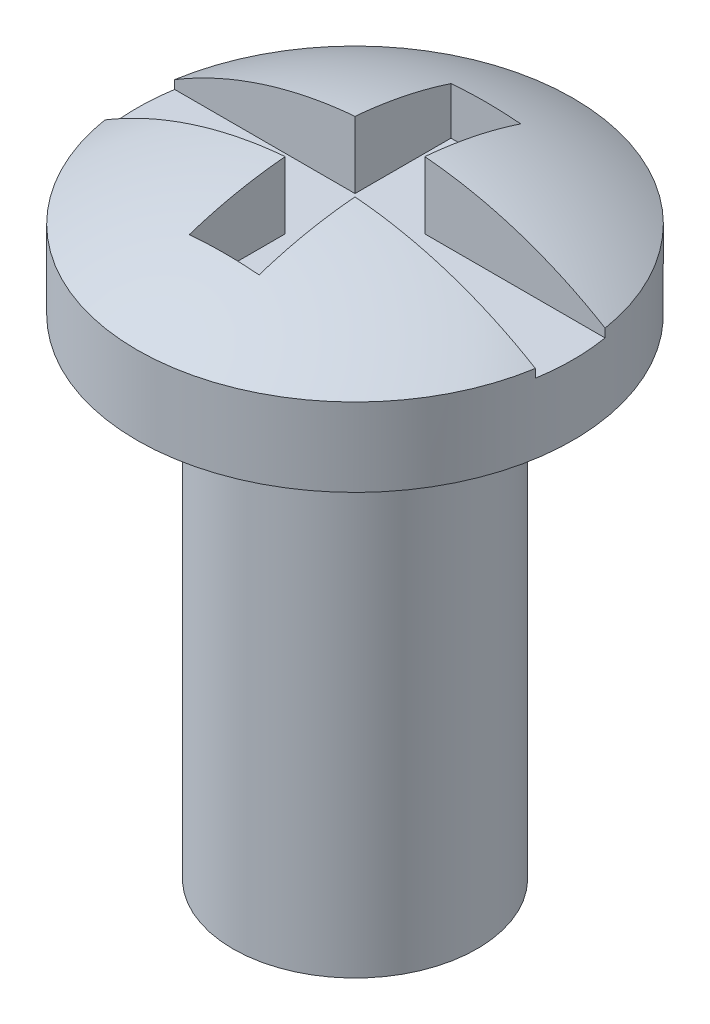
ISO-10303-21;
HEADER;
FILE_DESCRIPTION(('STEP AP214'),'2;1');
FILE_NAME('part.step','',(''),(''),'','','');
FILE_SCHEMA(('AUTOMOTIVE_DESIGN { 1 0 10303 214 1 1 1 1 }'));
ENDSEC;
DATA;
#1=APPLICATION_CONTEXT('core data for automotive mechanical design processes');
#2=APPLICATION_PROTOCOL_DEFINITION('international standard','automotive_design',2000,#1);
#3=PRODUCT_CONTEXT('',#1,'mechanical');
#4=PRODUCT('Part','Part','',(#3));
#5=PRODUCT_RELATED_PRODUCT_CATEGORY('part','',(#4));
#6=PRODUCT_DEFINITION_FORMATION('','',#4);
#7=PRODUCT_DEFINITION_CONTEXT('part definition',#1,'design');
#8=PRODUCT_DEFINITION('design','',#6,#7);
#9=PRODUCT_DEFINITION_SHAPE('','',#8);
#10=(LENGTH_UNIT() NAMED_UNIT(*) SI_UNIT(.MILLI.,.METRE.));
#11=(NAMED_UNIT(*) PLANE_ANGLE_UNIT() SI_UNIT($,.RADIAN.));
#12=(NAMED_UNIT(*) SI_UNIT($,.STERADIAN.) SOLID_ANGLE_UNIT());
#13=UNCERTAINTY_MEASURE_WITH_UNIT(LENGTH_MEASURE(1.E-05),#10,'distance_accuracy_value','');
#14=(GEOMETRIC_REPRESENTATION_CONTEXT(3) GLOBAL_UNCERTAINTY_ASSIGNED_CONTEXT((#13)) GLOBAL_UNIT_ASSIGNED_CONTEXT((#10,
#11,#12)) REPRESENTATION_CONTEXT('',''));
#15=CARTESIAN_POINT('',(0.,0.,0.));
#16=DIRECTION('',(0.,0.,1.));
#17=DIRECTION('',(1.,0.,0.));
#18=AXIS2_PLACEMENT_3D('',#15,#16,#17);
#19=CARTESIAN_POINT('',(-3.50234861591695,8.,-0.5));
#20=DIRECTION('',(0.,0.,-1.));
#21=DIRECTION('',(-1.,0.,0.));
#22=AXIS2_PLACEMENT_3D('',#19,#20,#21);
#23=PLANE('',#22);
#24=CARTESIAN_POINT('',(0.,3.,-0.5));
#25=DIRECTION('',(0.,0.,-1.));
#26=DIRECTION('',(-1.,0.,0.));
#27=AXIS2_PLACEMENT_3D('',#24,#25,#26);
#28=CIRCLE('',#27,5.9791303715507);
#29=CARTESIAN_POINT('',(-3.08474066981327,8.12195031213697,-0.5));
#30=VERTEX_POINT('',#29);
#31=CARTESIAN_POINT('',(-0.5,8.95818764390649,-0.5));
#32=VERTEX_POINT('',#31);
#33=EDGE_CURVE('E221',#30,#32,#28,.T.);
#34=ORIENTED_EDGE('',*,*,#33,.F.);
#35=DIRECTION('',(0.,-1.,0.));
#36=VECTOR('',#35,1.);
#37=CARTESIAN_POINT('',(-3.08474066981327,9.,-0.5));
#38=LINE('',#37,#36);
#39=CARTESIAN_POINT('',(-3.08474066981327,8.,-0.5));
#40=VERTEX_POINT('',#39);
#41=EDGE_CURVE('E164',#40,#30,#38,.F.);
#42=ORIENTED_EDGE('',*,*,#41,.F.);
#43=DIRECTION('',(-1.,0.,0.));
#44=VECTOR('',#43,1.);
#45=CARTESIAN_POINT('',(-3.50234861591695,8.,-0.5));
#46=LINE('',#45,#44);
#47=CARTESIAN_POINT('',(-0.5,8.,-0.5));
#48=VERTEX_POINT('',#47);
#49=EDGE_CURVE('E155',#48,#40,#46,.T.);
#50=ORIENTED_EDGE('',*,*,#49,.F.);
#51=DIRECTION('',(0.,1.,0.));
#52=VECTOR('',#51,1.);
#53=CARTESIAN_POINT('',(-0.5,8.,-0.5));
#54=LINE('',#53,#52);
#55=EDGE_CURVE('E148',#48,#32,#54,.T.);
#56=ORIENTED_EDGE('',*,*,#55,.T.);
#57=EDGE_LOOP('',(#34,#42,#50,#56));
#58=FACE_BOUND('',#57,.T.);
#59=ADVANCED_FACE('F32',(#58),#23,.F.);
#60=CARTESIAN_POINT('',(-3.50234861591695,8.,0.5));
#61=DIRECTION('',(0.,0.,1.));
#62=DIRECTION('',(1.,0.,0.));
#63=AXIS2_PLACEMENT_3D('',#60,#61,#62);
#64=PLANE('',#63);
#65=CARTESIAN_POINT('',(0.,3.,0.5));
#66=DIRECTION('',(0.,0.,1.));
#67=DIRECTION('',(1.,0.,0.));
#68=AXIS2_PLACEMENT_3D('',#65,#66,#67);
#69=CIRCLE('',#68,5.9791303715507);
#70=CARTESIAN_POINT('',(-0.499999999999999,8.95818764390649,0.5));
#71=VERTEX_POINT('',#70);
#72=CARTESIAN_POINT('',(-3.08474066981327,8.12195031213697,0.5));
#73=VERTEX_POINT('',#72);
#74=EDGE_CURVE('E191',#71,#73,#69,.T.);
#75=ORIENTED_EDGE('',*,*,#74,.F.);
#76=DIRECTION('',(0.,-1.,0.));
#77=VECTOR('',#76,1.);
#78=CARTESIAN_POINT('',(-0.5,8.,0.5));
#79=LINE('',#78,#77);
#80=CARTESIAN_POINT('',(-0.499999999999999,8.,0.5));
#81=VERTEX_POINT('',#80);
#82=EDGE_CURVE('E40',#71,#81,#79,.T.);
#83=ORIENTED_EDGE('',*,*,#82,.T.);
#84=DIRECTION('',(1.,0.,0.));
#85=VECTOR('',#84,1.);
#86=CARTESIAN_POINT('',(-3.50234861591695,8.,0.5));
#87=LINE('',#86,#85);
#88=CARTESIAN_POINT('',(-3.08474066981327,8.,0.5));
#89=VERTEX_POINT('',#88);
#90=EDGE_CURVE('E152',#89,#81,#87,.T.);
#91=ORIENTED_EDGE('',*,*,#90,.F.);
#92=DIRECTION('',(0.,-1.,0.));
#93=VECTOR('',#92,1.);
#94=CARTESIAN_POINT('',(-3.08474066981327,9.,0.5));
#95=LINE('',#94,#93);
#96=EDGE_CURVE('E162',#73,#89,#95,.T.);
#97=ORIENTED_EDGE('',*,*,#96,.F.);
#98=EDGE_LOOP('',(#75,#83,#91,#97));
#99=FACE_BOUND('',#98,.T.);
#100=ADVANCED_FACE('F189',(#99),#64,.F.);
#101=CARTESIAN_POINT('',(0.,9.,0.));
#102=DIRECTION('',(0.,-1.,0.));
#103=DIRECTION('',(0.,0.,-1.));
#104=AXIS2_PLACEMENT_3D('',#101,#102,#103);
#105=CYLINDRICAL_SURFACE('',#104,3.125);
#106=CARTESIAN_POINT('',(0.,7.,0.));
#107=DIRECTION('',(0.,1.,0.));
#108=DIRECTION('',(0.,0.,1.));
#109=AXIS2_PLACEMENT_3D('',#106,#107,#108);
#110=CIRCLE('',#109,3.125);
#111=CARTESIAN_POINT('',(0.,7.,3.125));
#112=VERTEX_POINT('',#111);
#113=EDGE_CURVE('E169',#112,#112,#110,.T.);
#114=ORIENTED_EDGE('',*,*,#113,.T.);
#115=EDGE_LOOP('',(#114));
#116=FACE_BOUND('',#115,.T.);
#117=CARTESIAN_POINT('',(0.,8.12195031213697,0.));
#118=DIRECTION('',(0.,-1.,0.));
#119=DIRECTION('',(0.,0.,-1.));
#120=AXIS2_PLACEMENT_3D('',#117,#118,#119);
#121=CIRCLE('',#120,3.125);
#122=CARTESIAN_POINT('',(3.08474066981327,8.12195031213697,0.5));
#123=VERTEX_POINT('',#122);
#124=EDGE_CURVE('E210',#73,#123,#121,.F.);
#125=ORIENTED_EDGE('',*,*,#124,.F.);
#126=ORIENTED_EDGE('',*,*,#96,.T.);
#127=CARTESIAN_POINT('',(0.,8.,0.));
#128=DIRECTION('',(0.,1.,0.));
#129=DIRECTION('',(0.,0.,1.));
#130=AXIS2_PLACEMENT_3D('',#127,#128,#129);
#131=CIRCLE('',#130,3.125);
#132=EDGE_CURVE('E176',#40,#89,#131,.T.);
#133=ORIENTED_EDGE('',*,*,#132,.F.);
#134=ORIENTED_EDGE('',*,*,#41,.T.);
#135=CARTESIAN_POINT('',(3.08474066981327,8.12195031213697,-0.5));
#136=VERTEX_POINT('',#135);
#137=EDGE_CURVE('E216',#136,#30,#121,.F.);
#138=ORIENTED_EDGE('',*,*,#137,.F.);
#139=DIRECTION('',(0.,-1.,0.));
#140=VECTOR('',#139,1.);
#141=CARTESIAN_POINT('',(3.08474066981327,9.,-0.5));
#142=LINE('',#141,#140);
#143=CARTESIAN_POINT('',(3.08474066981327,8.,-0.5));
#144=VERTEX_POINT('',#143);
#145=EDGE_CURVE('E167',#136,#144,#142,.T.);
#146=ORIENTED_EDGE('',*,*,#145,.T.);
#147=CARTESIAN_POINT('',(3.08474066981327,8.,0.5));
#148=VERTEX_POINT('',#147);
#149=EDGE_CURVE('E181',#148,#144,#131,.T.);
#150=ORIENTED_EDGE('',*,*,#149,.F.);
#151=DIRECTION('',(0.,-1.,0.));
#152=VECTOR('',#151,1.);
#153=CARTESIAN_POINT('',(3.08474066981327,9.,0.5));
#154=LINE('',#153,#152);
#155=EDGE_CURVE('E159',#148,#123,#154,.F.);
#156=ORIENTED_EDGE('',*,*,#155,.T.);
#157=EDGE_LOOP('',(#125,#126,#133,#134,#138,#146,#150,#156));
#158=FACE_BOUND('',#157,.T.);
#159=ADVANCED_FACE('F208',(#116,#158),#105,.T.);
#160=CARTESIAN_POINT('',(0.,3.,-0.5));
#161=DIRECTION('',(0.,0.,-1.));
#162=DIRECTION('',(-1.,0.,0.));
#163=AXIS2_PLACEMENT_3D('',#160,#161,#162);
#164=CIRCLE('',#163,5.9791303715507);
#165=CARTESIAN_POINT('',(0.5,8.95818764390649,-0.5));
#166=VERTEX_POINT('',#165);
#167=EDGE_CURVE('E222',#166,#136,#164,.T.);
#168=ORIENTED_EDGE('',*,*,#167,.F.);
#169=DIRECTION('',(0.,-1.,0.));
#170=VECTOR('',#169,1.);
#171=CARTESIAN_POINT('',(0.5,8.,-0.5));
#172=LINE('',#171,#170);
#173=CARTESIAN_POINT('',(0.5,8.,-0.5));
#174=VERTEX_POINT('',#173);
#175=EDGE_CURVE('E131',#166,#174,#172,.T.);
#176=ORIENTED_EDGE('',*,*,#175,.T.);
#177=EDGE_CURVE('E156',#144,#174,#46,.T.);
#178=ORIENTED_EDGE('',*,*,#177,.F.);
#179=ORIENTED_EDGE('',*,*,#145,.F.);
#180=EDGE_LOOP('',(#168,#176,#178,#179));
#181=FACE_BOUND('',#180,.T.);
#182=ADVANCED_FACE('F230',(#181),#23,.F.);
#183=CARTESIAN_POINT('',(0.,3.,0.5));
#184=DIRECTION('',(0.,0.,1.));
#185=DIRECTION('',(1.,0.,0.));
#186=AXIS2_PLACEMENT_3D('',#183,#184,#185);
#187=CIRCLE('',#186,5.9791303715507);
#188=CARTESIAN_POINT('',(0.5,8.95818764390649,0.5));
#189=VERTEX_POINT('',#188);
#190=EDGE_CURVE('E214',#123,#189,#187,.T.);
#191=ORIENTED_EDGE('',*,*,#190,.F.);
#192=ORIENTED_EDGE('',*,*,#155,.F.);
#193=CARTESIAN_POINT('',(0.5,8.,0.5));
#194=VERTEX_POINT('',#193);
#195=EDGE_CURVE('E151',#194,#148,#87,.T.);
#196=ORIENTED_EDGE('',*,*,#195,.F.);
#197=DIRECTION('',(0.,1.,0.));
#198=VECTOR('',#197,1.);
#199=CARTESIAN_POINT('',(0.5,8.,0.5));
#200=LINE('',#199,#198);
#201=EDGE_CURVE('E182',#194,#189,#200,.T.);
#202=ORIENTED_EDGE('',*,*,#201,.T.);
#203=EDGE_LOOP('',(#191,#192,#196,#202));
#204=FACE_BOUND('',#203,.T.);
#205=ADVANCED_FACE('F237',(#204),#64,.F.);
#206=CARTESIAN_POINT('',(0.5,8.,-1.875));
#207=DIRECTION('',(1.,0.,0.));
#208=DIRECTION('',(0.,0.,-1.));
#209=AXIS2_PLACEMENT_3D('',#206,#207,#208);
#210=PLANE('',#209);
#211=CARTESIAN_POINT('',(0.5,3.,0.));
#212=DIRECTION('',(1.,0.,0.));
#213=DIRECTION('',(0.,0.,-1.));
#214=AXIS2_PLACEMENT_3D('',#211,#212,#213);
#215=CIRCLE('',#214,5.9791303715507);
#216=CARTESIAN_POINT('',(0.499999999999999,8.67753247458788,1.875));
#217=VERTEX_POINT('',#216);
#218=EDGE_CURVE('E47',#189,#217,#215,.T.);
#219=ORIENTED_EDGE('',*,*,#218,.F.);
#220=ORIENTED_EDGE('',*,*,#201,.F.);
#221=DIRECTION('',(0.,0.,-1.));
#222=VECTOR('',#221,1.);
#223=CARTESIAN_POINT('',(0.5,8.,-1.875));
#224=LINE('',#223,#222);
#225=CARTESIAN_POINT('',(0.499999999999999,8.,1.875));
#226=VERTEX_POINT('',#225);
#227=EDGE_CURVE('E234',#226,#194,#224,.T.);
#228=ORIENTED_EDGE('',*,*,#227,.F.);
#229=DIRECTION('',(0.,1.,0.));
#230=VECTOR('',#229,1.);
#231=CARTESIAN_POINT('',(0.499999999999999,8.,1.875));
#232=LINE('',#231,#230);
#233=EDGE_CURVE('E137',#226,#217,#232,.T.);
#234=ORIENTED_EDGE('',*,*,#233,.T.);
#235=EDGE_LOOP('',(#219,#220,#228,#234));
#236=FACE_BOUND('',#235,.T.);
#237=ADVANCED_FACE('F240',(#236),#210,.F.);
#238=CARTESIAN_POINT('',(-0.5,8.,-1.875));
#239=DIRECTION('',(-1.,0.,0.));
#240=DIRECTION('',(0.,0.,1.));
#241=AXIS2_PLACEMENT_3D('',#238,#239,#240);
#242=PLANE('',#241);
#243=CARTESIAN_POINT('',(-0.5,3.,0.));
#244=DIRECTION('',(-1.,0.,0.));
#245=DIRECTION('',(0.,0.,1.));
#246=AXIS2_PLACEMENT_3D('',#243,#244,#245);
#247=CIRCLE('',#246,5.9791303715507);
#248=CARTESIAN_POINT('',(-0.499999999999999,8.67753247458788,1.875));
#249=VERTEX_POINT('',#248);
#250=EDGE_CURVE('E241',#249,#71,#247,.T.);
#251=ORIENTED_EDGE('',*,*,#250,.F.);
#252=DIRECTION('',(0.,1.,0.));
#253=VECTOR('',#252,1.);
#254=CARTESIAN_POINT('',(-0.499999999999999,8.,1.875));
#255=LINE('',#254,#253);
#256=CARTESIAN_POINT('',(-0.499999999999999,8.,1.875));
#257=VERTEX_POINT('',#256);
#258=EDGE_CURVE('E141',#257,#249,#255,.T.);
#259=ORIENTED_EDGE('',*,*,#258,.F.);
#260=DIRECTION('',(0.,0.,1.));
#261=VECTOR('',#260,1.);
#262=CARTESIAN_POINT('',(-0.5,8.,-1.875));
#263=LINE('',#262,#261);
#264=EDGE_CURVE('E195',#81,#257,#263,.T.);
#265=ORIENTED_EDGE('',*,*,#264,.F.);
#266=ORIENTED_EDGE('',*,*,#82,.F.);
#267=EDGE_LOOP('',(#251,#259,#265,#266));
#268=FACE_BOUND('',#267,.T.);
#269=ADVANCED_FACE('F196',(#268),#242,.F.);
#270=CARTESIAN_POINT('',(-0.499999999999999,8.,1.875));
#271=DIRECTION('',(0.,0.,1.));
#272=DIRECTION('',(1.,0.,0.));
#273=AXIS2_PLACEMENT_3D('',#270,#271,#272);
#274=PLANE('',#273);
#275=CARTESIAN_POINT('',(0.,3.,1.875));
#276=DIRECTION('',(0.,0.,1.));
#277=DIRECTION('',(1.,0.,0.));
#278=AXIS2_PLACEMENT_3D('',#275,#276,#277);
#279=CIRCLE('',#278,5.699506557589);
#280=EDGE_CURVE('E224',#217,#249,#279,.T.);
#281=ORIENTED_EDGE('',*,*,#280,.F.);
#282=ORIENTED_EDGE('',*,*,#233,.F.);
#283=DIRECTION('',(1.,0.,0.));
#284=VECTOR('',#283,1.);
#285=CARTESIAN_POINT('',(-0.499999999999999,8.,1.875));
#286=LINE('',#285,#284);
#287=EDGE_CURVE('E246',#257,#226,#286,.T.);
#288=ORIENTED_EDGE('',*,*,#287,.F.);
#289=ORIENTED_EDGE('',*,*,#258,.T.);
#290=EDGE_LOOP('',(#281,#282,#288,#289));
#291=FACE_BOUND('',#290,.T.);
#292=ADVANCED_FACE('F295',(#291),#274,.F.);
#293=CARTESIAN_POINT('',(-0.5,3.,0.));
#294=DIRECTION('',(-1.,0.,0.));
#295=DIRECTION('',(0.,0.,1.));
#296=AXIS2_PLACEMENT_3D('',#293,#294,#295);
#297=CIRCLE('',#296,5.9791303715507);
#298=CARTESIAN_POINT('',(-0.5,8.67753247458788,-1.875));
#299=VERTEX_POINT('',#298);
#300=EDGE_CURVE('E54',#32,#299,#297,.T.);
#301=ORIENTED_EDGE('',*,*,#300,.F.);
#302=ORIENTED_EDGE('',*,*,#55,.F.);
#303=CARTESIAN_POINT('',(-0.5,8.,-1.875));
#304=VERTEX_POINT('',#303);
#305=EDGE_CURVE('E200',#304,#48,#263,.T.);
#306=ORIENTED_EDGE('',*,*,#305,.F.);
#307=DIRECTION('',(0.,1.,0.));
#308=VECTOR('',#307,1.);
#309=CARTESIAN_POINT('',(-0.5,8.,-1.875));
#310=LINE('',#309,#308);
#311=EDGE_CURVE('E136',#304,#299,#310,.T.);
#312=ORIENTED_EDGE('',*,*,#311,.T.);
#313=EDGE_LOOP('',(#301,#302,#306,#312));
#314=FACE_BOUND('',#313,.T.);
#315=ADVANCED_FACE('F251',(#314),#242,.F.);
#316=CARTESIAN_POINT('',(0.5,3.,0.));
#317=DIRECTION('',(1.,0.,0.));
#318=DIRECTION('',(0.,0.,-1.));
#319=AXIS2_PLACEMENT_3D('',#316,#317,#318);
#320=CIRCLE('',#319,5.9791303715507);
#321=CARTESIAN_POINT('',(0.5,8.67753247458788,-1.875));
#322=VERTEX_POINT('',#321);
#323=EDGE_CURVE('E119',#322,#166,#320,.T.);
#324=ORIENTED_EDGE('',*,*,#323,.F.);
#325=DIRECTION('',(0.,1.,0.));
#326=VECTOR('',#325,1.);
#327=CARTESIAN_POINT('',(0.5,8.,-1.875));
#328=LINE('',#327,#326);
#329=CARTESIAN_POINT('',(0.5,8.,-1.875));
#330=VERTEX_POINT('',#329);
#331=EDGE_CURVE('E129',#330,#322,#328,.T.);
#332=ORIENTED_EDGE('',*,*,#331,.F.);
#333=EDGE_CURVE('E231',#174,#330,#224,.T.);
#334=ORIENTED_EDGE('',*,*,#333,.F.);
#335=ORIENTED_EDGE('',*,*,#175,.F.);
#336=EDGE_LOOP('',(#324,#332,#334,#335));
#337=FACE_BOUND('',#336,.T.);
#338=ADVANCED_FACE('F127',(#337),#210,.F.);
#339=CARTESIAN_POINT('',(-0.5,8.,-1.875));
#340=DIRECTION('',(0.,0.,-1.));
#341=DIRECTION('',(-1.,0.,0.));
#342=AXIS2_PLACEMENT_3D('',#339,#340,#341);
#343=PLANE('',#342);
#344=CARTESIAN_POINT('',(0.,3.,-1.875));
#345=DIRECTION('',(0.,0.,-1.));
#346=DIRECTION('',(-1.,0.,0.));
#347=AXIS2_PLACEMENT_3D('',#344,#345,#346);
#348=CIRCLE('',#347,5.699506557589);
#349=EDGE_CURVE('E11',#299,#322,#348,.T.);
#350=ORIENTED_EDGE('',*,*,#349,.F.);
#351=ORIENTED_EDGE('',*,*,#311,.F.);
#352=DIRECTION('',(-1.,0.,0.));
#353=VECTOR('',#352,1.);
#354=CARTESIAN_POINT('',(-0.5,8.,-1.875));
#355=LINE('',#354,#353);
#356=EDGE_CURVE('E135',#330,#304,#355,.T.);
#357=ORIENTED_EDGE('',*,*,#356,.F.);
#358=ORIENTED_EDGE('',*,*,#331,.T.);
#359=EDGE_LOOP('',(#350,#351,#357,#358));
#360=FACE_BOUND('',#359,.T.);
#361=ADVANCED_FACE('F133',(#360),#343,.F.);
#362=CARTESIAN_POINT('',(0.,7.,0.));
#363=DIRECTION('',(0.,-1.,0.));
#364=DIRECTION('',(0.,0.,-1.));
#365=AXIS2_PLACEMENT_3D('',#362,#363,#364);
#366=CYLINDRICAL_SURFACE('',#365,1.75);
#367=CARTESIAN_POINT('',(0.,7.,0.));
#368=DIRECTION('',(0.,1.,0.));
#369=DIRECTION('',(0.,0.,1.));
#370=AXIS2_PLACEMENT_3D('',#367,#368,#369);
#371=CIRCLE('',#370,1.75);
#372=CARTESIAN_POINT('',(0.,7.,1.75));
#373=VERTEX_POINT('',#372);
#374=EDGE_CURVE('E173',#373,#373,#371,.T.);
#375=ORIENTED_EDGE('',*,*,#374,.F.);
#376=EDGE_LOOP('',(#375));
#377=FACE_BOUND('',#376,.T.);
#378=CARTESIAN_POINT('',(0.,0.,0.));
#379=DIRECTION('',(0.,1.,0.));
#380=DIRECTION('',(0.,0.,1.));
#381=AXIS2_PLACEMENT_3D('',#378,#379,#380);
#382=CIRCLE('',#381,1.75);
#383=CARTESIAN_POINT('',(0.,0.,1.75));
#384=VERTEX_POINT('',#383);
#385=EDGE_CURVE('E172',#384,#384,#382,.T.);
#386=ORIENTED_EDGE('',*,*,#385,.T.);
#387=EDGE_LOOP('',(#386));
#388=FACE_BOUND('',#387,.T.);
#389=ADVANCED_FACE('F34',(#377,#388),#366,.T.);
#390=CARTESIAN_POINT('',(0.,0.,0.));
#391=DIRECTION('',(0.,1.,0.));
#392=DIRECTION('',(0.,0.,1.));
#393=AXIS2_PLACEMENT_3D('',#390,#391,#392);
#394=PLANE('',#393);
#395=ORIENTED_EDGE('',*,*,#385,.F.);
#396=EDGE_LOOP('',(#395));
#397=FACE_BOUND('',#396,.T.);
#398=ADVANCED_FACE('F271',(#397),#394,.F.);
#399=CARTESIAN_POINT('',(0.,7.,0.));
#400=DIRECTION('',(0.,1.,0.));
#401=DIRECTION('',(0.,0.,1.));
#402=AXIS2_PLACEMENT_3D('',#399,#400,#401);
#403=PLANE('',#402);
#404=ORIENTED_EDGE('',*,*,#113,.F.);
#405=EDGE_LOOP('',(#404));
#406=FACE_BOUND('',#405,.T.);
#407=ORIENTED_EDGE('',*,*,#374,.T.);
#408=EDGE_LOOP('',(#407));
#409=FACE_BOUND('',#408,.T.);
#410=ADVANCED_FACE('F270',(#406,#409),#403,.F.);
#411=CARTESIAN_POINT('',(-3.50234861591695,8.,0.5));
#412=DIRECTION('',(0.,1.,0.));
#413=DIRECTION('',(0.,0.,1.));
#414=AXIS2_PLACEMENT_3D('',#411,#412,#413);
#415=PLANE('',#414);
#416=ORIENTED_EDGE('',*,*,#177,.T.);
#417=ORIENTED_EDGE('',*,*,#333,.T.);
#418=ORIENTED_EDGE('',*,*,#356,.T.);
#419=ORIENTED_EDGE('',*,*,#305,.T.);
#420=ORIENTED_EDGE('',*,*,#49,.T.);
#421=ORIENTED_EDGE('',*,*,#132,.T.);
#422=ORIENTED_EDGE('',*,*,#90,.T.);
#423=ORIENTED_EDGE('',*,*,#264,.T.);
#424=ORIENTED_EDGE('',*,*,#287,.T.);
#425=ORIENTED_EDGE('',*,*,#227,.T.);
#426=ORIENTED_EDGE('',*,*,#195,.T.);
#427=ORIENTED_EDGE('',*,*,#149,.T.);
#428=EDGE_LOOP('',(#416,#417,#418,#419,#420,#421,#422,#423,#424,#425,#426,#427));
#429=FACE_BOUND('',#428,.T.);
#430=ADVANCED_FACE('F202',(#429),#415,.T.);
#431=CARTESIAN_POINT('',(0.,3.,0.));
#432=DIRECTION('',(0.,-1.,0.));
#433=DIRECTION('',(0.,0.,1.));
#434=AXIS2_PLACEMENT_3D('',#431,#432,#433);
#435=SPHERICAL_SURFACE('',#434,6.);
#436=ORIENTED_EDGE('',*,*,#33,.T.);
#437=ORIENTED_EDGE('',*,*,#300,.T.);
#438=ORIENTED_EDGE('',*,*,#349,.T.);
#439=ORIENTED_EDGE('',*,*,#323,.T.);
#440=ORIENTED_EDGE('',*,*,#167,.T.);
#441=ORIENTED_EDGE('',*,*,#137,.T.);
#442=EDGE_LOOP('',(#436,#437,#438,#439,#440,#441));
#443=FACE_BOUND('',#442,.T.);
#444=ADVANCED_FACE('F118',(#443),#435,.T.);
#445=ORIENTED_EDGE('',*,*,#74,.T.);
#446=ORIENTED_EDGE('',*,*,#124,.T.);
#447=ORIENTED_EDGE('',*,*,#190,.T.);
#448=ORIENTED_EDGE('',*,*,#218,.T.);
#449=ORIENTED_EDGE('',*,*,#280,.T.);
#450=ORIENTED_EDGE('',*,*,#250,.T.);
#451=EDGE_LOOP('',(#445,#446,#447,#448,#449,#450));
#452=FACE_BOUND('',#451,.T.);
#453=ADVANCED_FACE('F238',(#452),#435,.T.);
#454=CLOSED_SHELL('',(#59,#100,#159,#182,#205,#237,#269,#292,#315,#338,#361,#389,#398,#410,#430,
#444,#453));
#455=MANIFOLD_SOLID_BREP('B2',#454);
#456=ADVANCED_BREP_SHAPE_REPRESENTATION('',(#18,#455),#14);
#457=SHAPE_DEFINITION_REPRESENTATION(#9,#456);
ENDSEC;
END-ISO-10303-21;
